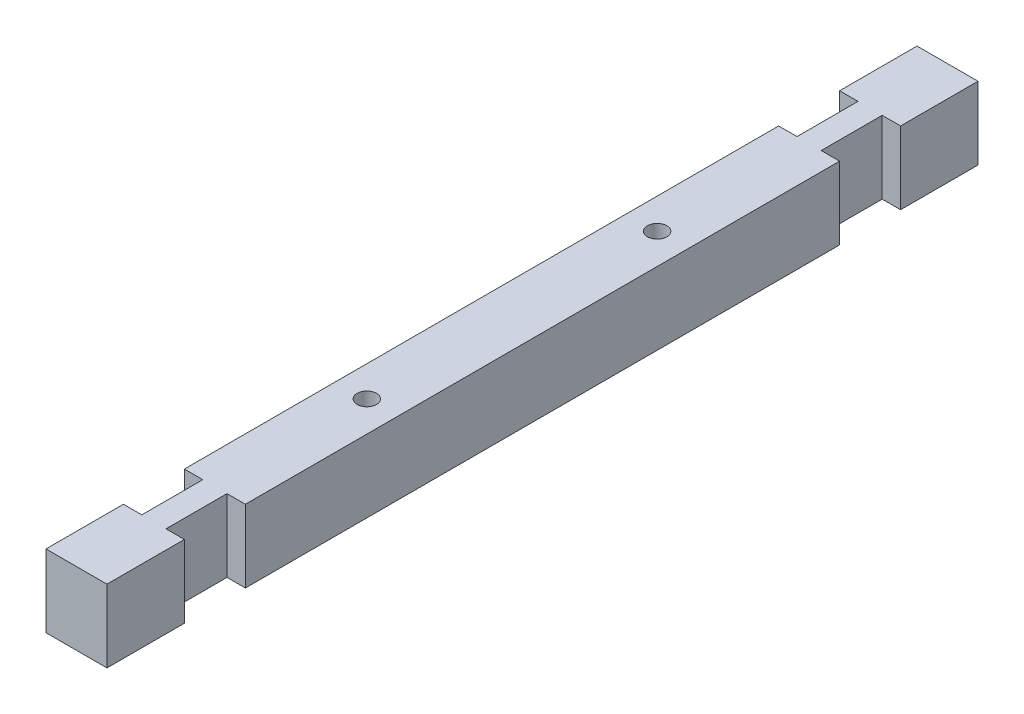
ISO-10303-21;
HEADER;
FILE_DESCRIPTION(('STEP AP214'),'2;1');
FILE_NAME('part.step','',(''),(''),'','','');
FILE_SCHEMA(('AUTOMOTIVE_DESIGN { 1 0 10303 214 1 1 1 1 }'));
ENDSEC;
DATA;
#1=APPLICATION_CONTEXT('core data for automotive mechanical design processes');
#2=APPLICATION_PROTOCOL_DEFINITION('international standard','automotive_design',2000,#1);
#3=PRODUCT_CONTEXT('',#1,'mechanical');
#4=PRODUCT('Part','Part','',(#3));
#5=PRODUCT_RELATED_PRODUCT_CATEGORY('part','',(#4));
#6=PRODUCT_DEFINITION_FORMATION('','',#4);
#7=PRODUCT_DEFINITION_CONTEXT('part definition',#1,'design');
#8=PRODUCT_DEFINITION('design','',#6,#7);
#9=PRODUCT_DEFINITION_SHAPE('','',#8);
#10=(LENGTH_UNIT() NAMED_UNIT(*) SI_UNIT(.MILLI.,.METRE.));
#11=(NAMED_UNIT(*) PLANE_ANGLE_UNIT() SI_UNIT($,.RADIAN.));
#12=(NAMED_UNIT(*) SI_UNIT($,.STERADIAN.) SOLID_ANGLE_UNIT());
#13=UNCERTAINTY_MEASURE_WITH_UNIT(LENGTH_MEASURE(1.E-05),#10,'distance_accuracy_value','');
#14=(GEOMETRIC_REPRESENTATION_CONTEXT(3) GLOBAL_UNCERTAINTY_ASSIGNED_CONTEXT((#13)) GLOBAL_UNIT_ASSIGNED_CONTEXT((#10,
#11,#12)) REPRESENTATION_CONTEXT('',''));
#15=CARTESIAN_POINT('',(0.,0.,0.));
#16=DIRECTION('',(0.,0.,1.));
#17=DIRECTION('',(1.,0.,0.));
#18=AXIS2_PLACEMENT_3D('',#15,#16,#17);
#19=CARTESIAN_POINT('',(0.,0.,900.));
#20=DIRECTION('',(1.,0.,0.));
#21=DIRECTION('',(0.,0.,-1.));
#22=AXIS2_PLACEMENT_3D('',#19,#20,#21);
#23=PLANE('',#22);
#24=DIRECTION('',(0.,-1.,0.));
#25=VECTOR('',#24,1.);
#26=CARTESIAN_POINT('',(0.,75.0000000000001,143.));
#27=LINE('',#26,#25);
#28=CARTESIAN_POINT('',(0.,75.0000000000001,143.));
#29=VERTEX_POINT('',#28);
#30=CARTESIAN_POINT('',(0.,0.,143.));
#31=VERTEX_POINT('',#30);
#32=EDGE_CURVE('E433',#29,#31,#27,.T.);
#33=ORIENTED_EDGE('',*,*,#32,.T.);
#34=DIRECTION('',(0.,0.,-1.));
#35=VECTOR('',#34,1.);
#36=CARTESIAN_POINT('',(0.,0.,900.));
#37=LINE('',#36,#35);
#38=CARTESIAN_POINT('',(0.,0.,757.));
#39=VERTEX_POINT('',#38);
#40=EDGE_CURVE('E41',#39,#31,#37,.T.);
#41=ORIENTED_EDGE('',*,*,#40,.F.);
#42=DIRECTION('',(0.,1.,0.));
#43=VECTOR('',#42,1.);
#44=CARTESIAN_POINT('',(0.,75.0000000000001,757.));
#45=LINE('',#44,#43);
#46=CARTESIAN_POINT('',(0.,75.0000000000001,757.));
#47=VERTEX_POINT('',#46);
#48=EDGE_CURVE('E202',#39,#47,#45,.T.);
#49=ORIENTED_EDGE('',*,*,#48,.T.);
#50=DIRECTION('',(0.,0.,-1.));
#51=VECTOR('',#50,1.);
#52=CARTESIAN_POINT('',(0.,75.,900.));
#53=LINE('',#52,#51);
#54=EDGE_CURVE('E298',#47,#29,#53,.T.);
#55=ORIENTED_EDGE('',*,*,#54,.T.);
#56=EDGE_LOOP('',(#33,#41,#49,#55));
#57=FACE_BOUND('',#56,.T.);
#58=ADVANCED_FACE('F33',(#57),#23,.F.);
#59=DIRECTION('',(0.,1.,0.));
#60=VECTOR('',#59,1.);
#61=CARTESIAN_POINT('',(0.,75.,80.));
#62=LINE('',#61,#60);
#63=CARTESIAN_POINT('',(0.,0.,80.));
#64=VERTEX_POINT('',#63);
#65=CARTESIAN_POINT('',(0.,75.,80.));
#66=VERTEX_POINT('',#65);
#67=EDGE_CURVE('E436',#64,#66,#62,.T.);
#68=ORIENTED_EDGE('',*,*,#67,.T.);
#69=CARTESIAN_POINT('',(0.,75.,0.));
#70=VERTEX_POINT('',#69);
#71=EDGE_CURVE('E283',#66,#70,#53,.T.);
#72=ORIENTED_EDGE('',*,*,#71,.T.);
#73=DIRECTION('',(0.,-1.,0.));
#74=VECTOR('',#73,1.);
#75=CARTESIAN_POINT('',(0.,0.,0.));
#76=LINE('',#75,#74);
#77=CARTESIAN_POINT('',(0.,0.,0.));
#78=VERTEX_POINT('',#77);
#79=EDGE_CURVE('E265',#70,#78,#76,.T.);
#80=ORIENTED_EDGE('',*,*,#79,.T.);
#81=EDGE_CURVE('E42',#64,#78,#37,.T.);
#82=ORIENTED_EDGE('',*,*,#81,.F.);
#83=EDGE_LOOP('',(#68,#72,#80,#82));
#84=FACE_BOUND('',#83,.T.);
#85=ADVANCED_FACE('F362',(#84),#23,.F.);
#86=CARTESIAN_POINT('',(0.,0.,900.));
#87=DIRECTION('',(0.,1.,0.));
#88=DIRECTION('',(0.,0.,1.));
#89=AXIS2_PLACEMENT_3D('',#86,#87,#88);
#90=PLANE('',#89);
#91=CARTESIAN_POINT('',(31.5,0.,600.));
#92=DIRECTION('',(0.,1.,0.));
#93=DIRECTION('',(0.,0.,-1.));
#94=AXIS2_PLACEMENT_3D('',#91,#92,#93);
#95=CIRCLE('',#94,10.);
#96=CARTESIAN_POINT('',(31.5,0.,590.));
#97=VERTEX_POINT('',#96);
#98=EDGE_CURVE('E422',#97,#97,#95,.T.);
#99=ORIENTED_EDGE('',*,*,#98,.T.);
#100=EDGE_LOOP('',(#99));
#101=FACE_BOUND('',#100,.T.);
#102=CARTESIAN_POINT('',(31.5,0.,300.));
#103=DIRECTION('',(0.,1.,0.));
#104=DIRECTION('',(0.,0.,1.));
#105=AXIS2_PLACEMENT_3D('',#102,#103,#104);
#106=CIRCLE('',#105,10.);
#107=CARTESIAN_POINT('',(31.5,0.,310.));
#108=VERTEX_POINT('',#107);
#109=EDGE_CURVE('E430',#108,#108,#106,.T.);
#110=ORIENTED_EDGE('',*,*,#109,.T.);
#111=EDGE_LOOP('',(#110));
#112=FACE_BOUND('',#111,.T.);
#113=DIRECTION('',(-1.,0.,0.));
#114=VECTOR('',#113,1.);
#115=CARTESIAN_POINT('',(19.,0.,143.));
#116=LINE('',#115,#114);
#117=CARTESIAN_POINT('',(19.,0.,143.));
#118=VERTEX_POINT('',#117);
#119=EDGE_CURVE('E173',#118,#31,#116,.T.);
#120=ORIENTED_EDGE('',*,*,#119,.F.);
#121=DIRECTION('',(0.,0.,-1.));
#122=VECTOR('',#121,1.);
#123=CARTESIAN_POINT('',(19.,0.,80.));
#124=LINE('',#123,#122);
#125=CARTESIAN_POINT('',(19.,0.,80.));
#126=VERTEX_POINT('',#125);
#127=EDGE_CURVE('E178',#118,#126,#124,.T.);
#128=ORIENTED_EDGE('',*,*,#127,.T.);
#129=DIRECTION('',(-1.,0.,0.));
#130=VECTOR('',#129,1.);
#131=CARTESIAN_POINT('',(19.,0.,80.));
#132=LINE('',#131,#130);
#133=EDGE_CURVE('E192',#126,#64,#132,.T.);
#134=ORIENTED_EDGE('',*,*,#133,.T.);
#135=ORIENTED_EDGE('',*,*,#81,.T.);
#136=DIRECTION('',(1.,0.,0.));
#137=VECTOR('',#136,1.);
#138=CARTESIAN_POINT('',(0.,0.,0.));
#139=LINE('',#138,#137);
#140=CARTESIAN_POINT('',(63.,0.,0.));
#141=VERTEX_POINT('',#140);
#142=EDGE_CURVE('E286',#78,#141,#139,.T.);
#143=ORIENTED_EDGE('',*,*,#142,.T.);
#144=DIRECTION('',(0.,0.,-1.));
#145=VECTOR('',#144,1.);
#146=CARTESIAN_POINT('',(63.,0.,900.));
#147=LINE('',#146,#145);
#148=CARTESIAN_POINT('',(63.,0.,80.));
#149=VERTEX_POINT('',#148);
#150=EDGE_CURVE('E301',#149,#141,#147,.T.);
#151=ORIENTED_EDGE('',*,*,#150,.F.);
#152=DIRECTION('',(1.,0.,0.));
#153=VECTOR('',#152,1.);
#154=CARTESIAN_POINT('',(44.,0.,80.));
#155=LINE('',#154,#153);
#156=CARTESIAN_POINT('',(44.,0.,80.));
#157=VERTEX_POINT('',#156);
#158=EDGE_CURVE('E242',#157,#149,#155,.T.);
#159=ORIENTED_EDGE('',*,*,#158,.F.);
#160=DIRECTION('',(0.,0.,-1.));
#161=VECTOR('',#160,1.);
#162=CARTESIAN_POINT('',(44.,0.,80.));
#163=LINE('',#162,#161);
#164=CARTESIAN_POINT('',(44.,0.,143.));
#165=VERTEX_POINT('',#164);
#166=EDGE_CURVE('E231',#165,#157,#163,.T.);
#167=ORIENTED_EDGE('',*,*,#166,.F.);
#168=DIRECTION('',(1.,0.,0.));
#169=VECTOR('',#168,1.);
#170=CARTESIAN_POINT('',(44.,0.,143.));
#171=LINE('',#170,#169);
#172=CARTESIAN_POINT('',(63.,0.,143.));
#173=VERTEX_POINT('',#172);
#174=EDGE_CURVE('E244',#165,#173,#171,.T.);
#175=ORIENTED_EDGE('',*,*,#174,.T.);
#176=CARTESIAN_POINT('',(63.,0.,757.));
#177=VERTEX_POINT('',#176);
#178=EDGE_CURVE('E305',#177,#173,#147,.T.);
#179=ORIENTED_EDGE('',*,*,#178,.F.);
#180=DIRECTION('',(1.,0.,0.));
#181=VECTOR('',#180,1.);
#182=CARTESIAN_POINT('',(44.,0.,757.));
#183=LINE('',#182,#181);
#184=CARTESIAN_POINT('',(44.,0.,757.));
#185=VERTEX_POINT('',#184);
#186=EDGE_CURVE('E269',#185,#177,#183,.T.);
#187=ORIENTED_EDGE('',*,*,#186,.F.);
#188=DIRECTION('',(0.,0.,-1.));
#189=VECTOR('',#188,1.);
#190=CARTESIAN_POINT('',(44.,0.,820.));
#191=LINE('',#190,#189);
#192=CARTESIAN_POINT('',(44.,0.,820.));
#193=VERTEX_POINT('',#192);
#194=EDGE_CURVE('E251',#193,#185,#191,.T.);
#195=ORIENTED_EDGE('',*,*,#194,.F.);
#196=DIRECTION('',(1.,0.,0.));
#197=VECTOR('',#196,1.);
#198=CARTESIAN_POINT('',(44.,0.,820.));
#199=LINE('',#198,#197);
#200=CARTESIAN_POINT('',(63.,0.,820.));
#201=VERTEX_POINT('',#200);
#202=EDGE_CURVE('E260',#193,#201,#199,.T.);
#203=ORIENTED_EDGE('',*,*,#202,.T.);
#204=CARTESIAN_POINT('',(63.,0.,900.));
#205=VERTEX_POINT('',#204);
#206=EDGE_CURVE('E303',#205,#201,#147,.T.);
#207=ORIENTED_EDGE('',*,*,#206,.F.);
#208=DIRECTION('',(1.,0.,0.));
#209=VECTOR('',#208,1.);
#210=CARTESIAN_POINT('',(0.,0.,900.));
#211=LINE('',#210,#209);
#212=CARTESIAN_POINT('',(0.,0.,900.));
#213=VERTEX_POINT('',#212);
#214=EDGE_CURVE('E276',#213,#205,#211,.T.);
#215=ORIENTED_EDGE('',*,*,#214,.F.);
#216=CARTESIAN_POINT('',(0.,0.,820.));
#217=VERTEX_POINT('',#216);
#218=EDGE_CURVE('E11',#213,#217,#37,.T.);
#219=ORIENTED_EDGE('',*,*,#218,.T.);
#220=DIRECTION('',(-1.,0.,0.));
#221=VECTOR('',#220,1.);
#222=CARTESIAN_POINT('',(19.,0.,820.));
#223=LINE('',#222,#221);
#224=CARTESIAN_POINT('',(19.,0.,820.));
#225=VERTEX_POINT('',#224);
#226=EDGE_CURVE('E221',#225,#217,#223,.T.);
#227=ORIENTED_EDGE('',*,*,#226,.F.);
#228=DIRECTION('',(0.,0.,-1.));
#229=VECTOR('',#228,1.);
#230=CARTESIAN_POINT('',(19.,0.,820.));
#231=LINE('',#230,#229);
#232=CARTESIAN_POINT('',(19.,0.,757.));
#233=VERTEX_POINT('',#232);
#234=EDGE_CURVE('E201',#225,#233,#231,.T.);
#235=ORIENTED_EDGE('',*,*,#234,.T.);
#236=DIRECTION('',(-1.,0.,0.));
#237=VECTOR('',#236,1.);
#238=CARTESIAN_POINT('',(19.,0.,757.));
#239=LINE('',#238,#237);
#240=EDGE_CURVE('E219',#233,#39,#239,.T.);
#241=ORIENTED_EDGE('',*,*,#240,.T.);
#242=ORIENTED_EDGE('',*,*,#40,.T.);
#243=EDGE_LOOP('',(#120,#128,#134,#135,#143,#151,#159,#167,#175,#179,#187,#195,#203,#207,#215,
#219,#227,#235,#241,#242));
#244=FACE_BOUND('',#243,.T.);
#245=ADVANCED_FACE('F189',(#101,#112,#244),#90,.F.);
#246=CARTESIAN_POINT('',(0.,75.,900.));
#247=DIRECTION('',(0.,-1.,0.));
#248=DIRECTION('',(0.,0.,-1.));
#249=AXIS2_PLACEMENT_3D('',#246,#247,#248);
#250=PLANE('',#249);
#251=CARTESIAN_POINT('',(31.5,75.,600.));
#252=DIRECTION('',(0.,1.,0.));
#253=DIRECTION('',(0.,0.,-1.));
#254=AXIS2_PLACEMENT_3D('',#251,#252,#253);
#255=CIRCLE('',#254,10.);
#256=CARTESIAN_POINT('',(31.5,75.,590.));
#257=VERTEX_POINT('',#256);
#258=EDGE_CURVE('E425',#257,#257,#255,.T.);
#259=ORIENTED_EDGE('',*,*,#258,.F.);
#260=EDGE_LOOP('',(#259));
#261=FACE_BOUND('',#260,.T.);
#262=CARTESIAN_POINT('',(31.5,75.,300.));
#263=DIRECTION('',(0.,1.,0.));
#264=DIRECTION('',(0.,0.,1.));
#265=AXIS2_PLACEMENT_3D('',#262,#263,#264);
#266=CIRCLE('',#265,10.);
#267=CARTESIAN_POINT('',(31.5,75.,310.));
#268=VERTEX_POINT('',#267);
#269=EDGE_CURVE('E427',#268,#268,#266,.T.);
#270=ORIENTED_EDGE('',*,*,#269,.F.);
#271=EDGE_LOOP('',(#270));
#272=FACE_BOUND('',#271,.T.);
#273=DIRECTION('',(-1.,0.,0.));
#274=VECTOR('',#273,1.);
#275=CARTESIAN_POINT('',(19.,75.0000000000001,143.));
#276=LINE('',#275,#274);
#277=CARTESIAN_POINT('',(19.,75.,143.));
#278=VERTEX_POINT('',#277);
#279=EDGE_CURVE('E49',#278,#29,#276,.T.);
#280=ORIENTED_EDGE('',*,*,#279,.T.);
#281=ORIENTED_EDGE('',*,*,#54,.F.);
#282=DIRECTION('',(-1.,0.,0.));
#283=VECTOR('',#282,1.);
#284=CARTESIAN_POINT('',(19.,75.0000000000001,757.));
#285=LINE('',#284,#283);
#286=CARTESIAN_POINT('',(19.,75.0000000000001,757.));
#287=VERTEX_POINT('',#286);
#288=EDGE_CURVE('E217',#287,#47,#285,.T.);
#289=ORIENTED_EDGE('',*,*,#288,.F.);
#290=DIRECTION('',(0.,0.,1.));
#291=VECTOR('',#290,1.);
#292=CARTESIAN_POINT('',(19.,75.,820.));
#293=LINE('',#292,#291);
#294=CARTESIAN_POINT('',(19.,75.,820.));
#295=VERTEX_POINT('',#294);
#296=EDGE_CURVE('E207',#287,#295,#293,.T.);
#297=ORIENTED_EDGE('',*,*,#296,.T.);
#298=DIRECTION('',(-1.,0.,0.));
#299=VECTOR('',#298,1.);
#300=CARTESIAN_POINT('',(19.,75.,820.));
#301=LINE('',#300,#299);
#302=CARTESIAN_POINT('',(0.,75.,820.));
#303=VERTEX_POINT('',#302);
#304=EDGE_CURVE('E210',#295,#303,#301,.T.);
#305=ORIENTED_EDGE('',*,*,#304,.T.);
#306=CARTESIAN_POINT('',(0.,75.,900.));
#307=VERTEX_POINT('',#306);
#308=EDGE_CURVE('E294',#307,#303,#53,.T.);
#309=ORIENTED_EDGE('',*,*,#308,.F.);
#310=DIRECTION('',(-1.,0.,0.));
#311=VECTOR('',#310,1.);
#312=CARTESIAN_POINT('',(0.,75.,900.));
#313=LINE('',#312,#311);
#314=CARTESIAN_POINT('',(63.,75.,900.));
#315=VERTEX_POINT('',#314);
#316=EDGE_CURVE('E281',#315,#307,#313,.T.);
#317=ORIENTED_EDGE('',*,*,#316,.F.);
#318=DIRECTION('',(0.,0.,-1.));
#319=VECTOR('',#318,1.);
#320=CARTESIAN_POINT('',(63.,75.,900.));
#321=LINE('',#320,#319);
#322=CARTESIAN_POINT('',(63.,75.,820.));
#323=VERTEX_POINT('',#322);
#324=EDGE_CURVE('E299',#315,#323,#321,.T.);
#325=ORIENTED_EDGE('',*,*,#324,.T.);
#326=DIRECTION('',(1.,0.,0.));
#327=VECTOR('',#326,1.);
#328=CARTESIAN_POINT('',(44.,75.,820.));
#329=LINE('',#328,#327);
#330=CARTESIAN_POINT('',(44.,75.,820.));
#331=VERTEX_POINT('',#330);
#332=EDGE_CURVE('E263',#331,#323,#329,.T.);
#333=ORIENTED_EDGE('',*,*,#332,.F.);
#334=DIRECTION('',(0.,0.,1.));
#335=VECTOR('',#334,1.);
#336=CARTESIAN_POINT('',(44.,75.,820.));
#337=LINE('',#336,#335);
#338=CARTESIAN_POINT('',(44.,75.,757.));
#339=VERTEX_POINT('',#338);
#340=EDGE_CURVE('E257',#339,#331,#337,.T.);
#341=ORIENTED_EDGE('',*,*,#340,.F.);
#342=DIRECTION('',(1.,0.,0.));
#343=VECTOR('',#342,1.);
#344=CARTESIAN_POINT('',(44.,75.0000000000001,757.));
#345=LINE('',#344,#343);
#346=CARTESIAN_POINT('',(63.,75.0000000000001,757.));
#347=VERTEX_POINT('',#346);
#348=EDGE_CURVE('E266',#339,#347,#345,.T.);
#349=ORIENTED_EDGE('',*,*,#348,.T.);
#350=CARTESIAN_POINT('',(63.,75.0000000000001,143.));
#351=VERTEX_POINT('',#350);
#352=EDGE_CURVE('E302',#347,#351,#321,.T.);
#353=ORIENTED_EDGE('',*,*,#352,.T.);
#354=DIRECTION('',(1.,0.,0.));
#355=VECTOR('',#354,1.);
#356=CARTESIAN_POINT('',(44.,75.0000000000001,143.));
#357=LINE('',#356,#355);
#358=CARTESIAN_POINT('',(44.,75.0000000000001,143.));
#359=VERTEX_POINT('',#358);
#360=EDGE_CURVE('E235',#359,#351,#357,.T.);
#361=ORIENTED_EDGE('',*,*,#360,.F.);
#362=DIRECTION('',(0.,0.,1.));
#363=VECTOR('',#362,1.);
#364=CARTESIAN_POINT('',(44.,75.,80.));
#365=LINE('',#364,#363);
#366=CARTESIAN_POINT('',(44.,75.,80.));
#367=VERTEX_POINT('',#366);
#368=EDGE_CURVE('E224',#367,#359,#365,.T.);
#369=ORIENTED_EDGE('',*,*,#368,.F.);
#370=DIRECTION('',(1.,0.,0.));
#371=VECTOR('',#370,1.);
#372=CARTESIAN_POINT('',(44.,75.,80.));
#373=LINE('',#372,#371);
#374=CARTESIAN_POINT('',(63.,75.,80.));
#375=VERTEX_POINT('',#374);
#376=EDGE_CURVE('E238',#367,#375,#373,.T.);
#377=ORIENTED_EDGE('',*,*,#376,.T.);
#378=CARTESIAN_POINT('',(63.,75.,0.));
#379=VERTEX_POINT('',#378);
#380=EDGE_CURVE('E297',#375,#379,#321,.T.);
#381=ORIENTED_EDGE('',*,*,#380,.T.);
#382=DIRECTION('',(-1.,0.,0.));
#383=VECTOR('',#382,1.);
#384=CARTESIAN_POINT('',(0.,75.,0.));
#385=LINE('',#384,#383);
#386=EDGE_CURVE('E277',#379,#70,#385,.T.);
#387=ORIENTED_EDGE('',*,*,#386,.T.);
#388=ORIENTED_EDGE('',*,*,#71,.F.);
#389=DIRECTION('',(-1.,0.,0.));
#390=VECTOR('',#389,1.);
#391=CARTESIAN_POINT('',(19.,75.,80.));
#392=LINE('',#391,#390);
#393=CARTESIAN_POINT('',(19.,75.,80.));
#394=VERTEX_POINT('',#393);
#395=EDGE_CURVE('E196',#394,#66,#392,.T.);
#396=ORIENTED_EDGE('',*,*,#395,.F.);
#397=DIRECTION('',(0.,0.,1.));
#398=VECTOR('',#397,1.);
#399=CARTESIAN_POINT('',(19.,75.,80.));
#400=LINE('',#399,#398);
#401=EDGE_CURVE('E179',#394,#278,#400,.T.);
#402=ORIENTED_EDGE('',*,*,#401,.T.);
#403=EDGE_LOOP('',(#280,#281,#289,#297,#305,#309,#317,#325,#333,#341,#349,#353,#361,#369,#377,
#381,#387,#388,#396,#402));
#404=FACE_BOUND('',#403,.T.);
#405=ADVANCED_FACE('F326',(#261,#272,#404),#250,.F.);
#406=DIRECTION('',(0.,-1.,0.));
#407=VECTOR('',#406,1.);
#408=CARTESIAN_POINT('',(0.,75.,820.));
#409=LINE('',#408,#407);
#410=EDGE_CURVE('E194',#303,#217,#409,.T.);
#411=ORIENTED_EDGE('',*,*,#410,.T.);
#412=ORIENTED_EDGE('',*,*,#218,.F.);
#413=DIRECTION('',(0.,-1.,0.));
#414=VECTOR('',#413,1.);
#415=CARTESIAN_POINT('',(0.,0.,900.));
#416=LINE('',#415,#414);
#417=EDGE_CURVE('E273',#307,#213,#416,.T.);
#418=ORIENTED_EDGE('',*,*,#417,.F.);
#419=ORIENTED_EDGE('',*,*,#308,.T.);
#420=EDGE_LOOP('',(#411,#412,#418,#419));
#421=FACE_BOUND('',#420,.T.);
#422=ADVANCED_FACE('F35',(#421),#23,.F.);
#423=CARTESIAN_POINT('',(63.,0.,900.));
#424=DIRECTION('',(-1.,0.,0.));
#425=DIRECTION('',(0.,0.,1.));
#426=AXIS2_PLACEMENT_3D('',#423,#424,#425);
#427=PLANE('',#426);
#428=ORIENTED_EDGE('',*,*,#380,.F.);
#429=DIRECTION('',(0.,1.,0.));
#430=VECTOR('',#429,1.);
#431=CARTESIAN_POINT('',(63.,75.,80.));
#432=LINE('',#431,#430);
#433=EDGE_CURVE('E228',#149,#375,#432,.T.);
#434=ORIENTED_EDGE('',*,*,#433,.F.);
#435=ORIENTED_EDGE('',*,*,#150,.T.);
#436=DIRECTION('',(0.,1.,0.));
#437=VECTOR('',#436,1.);
#438=CARTESIAN_POINT('',(63.,0.,0.));
#439=LINE('',#438,#437);
#440=EDGE_CURVE('E289',#141,#379,#439,.T.);
#441=ORIENTED_EDGE('',*,*,#440,.T.);
#442=EDGE_LOOP('',(#428,#434,#435,#441));
#443=FACE_BOUND('',#442,.T.);
#444=ADVANCED_FACE('F315',(#443),#427,.F.);
#445=ORIENTED_EDGE('',*,*,#206,.T.);
#446=DIRECTION('',(0.,-1.,0.));
#447=VECTOR('',#446,1.);
#448=CARTESIAN_POINT('',(63.,75.,820.));
#449=LINE('',#448,#447);
#450=EDGE_CURVE('E241',#323,#201,#449,.T.);
#451=ORIENTED_EDGE('',*,*,#450,.F.);
#452=ORIENTED_EDGE('',*,*,#324,.F.);
#453=DIRECTION('',(0.,1.,0.));
#454=VECTOR('',#453,1.);
#455=CARTESIAN_POINT('',(63.,0.,900.));
#456=LINE('',#455,#454);
#457=EDGE_CURVE('E279',#205,#315,#456,.T.);
#458=ORIENTED_EDGE('',*,*,#457,.F.);
#459=EDGE_LOOP('',(#445,#451,#452,#458));
#460=FACE_BOUND('',#459,.T.);
#461=ADVANCED_FACE('F374',(#460),#427,.F.);
#462=ORIENTED_EDGE('',*,*,#178,.T.);
#463=DIRECTION('',(0.,-1.,0.));
#464=VECTOR('',#463,1.);
#465=CARTESIAN_POINT('',(63.,75.0000000000001,143.));
#466=LINE('',#465,#464);
#467=EDGE_CURVE('E223',#351,#173,#466,.T.);
#468=ORIENTED_EDGE('',*,*,#467,.F.);
#469=ORIENTED_EDGE('',*,*,#352,.F.);
#470=DIRECTION('',(0.,1.,0.));
#471=VECTOR('',#470,1.);
#472=CARTESIAN_POINT('',(63.,75.0000000000001,757.));
#473=LINE('',#472,#471);
#474=EDGE_CURVE('E252',#177,#347,#473,.T.);
#475=ORIENTED_EDGE('',*,*,#474,.F.);
#476=EDGE_LOOP('',(#462,#468,#469,#475));
#477=FACE_BOUND('',#476,.T.);
#478=ADVANCED_FACE('F338',(#477),#427,.F.);
#479=CARTESIAN_POINT('',(0.,0.,900.));
#480=DIRECTION('',(0.,0.,-1.));
#481=DIRECTION('',(-1.,0.,0.));
#482=AXIS2_PLACEMENT_3D('',#479,#480,#481);
#483=PLANE('',#482);
#484=ORIENTED_EDGE('',*,*,#417,.T.);
#485=ORIENTED_EDGE('',*,*,#214,.T.);
#486=ORIENTED_EDGE('',*,*,#457,.T.);
#487=ORIENTED_EDGE('',*,*,#316,.T.);
#488=EDGE_LOOP('',(#484,#485,#486,#487));
#489=FACE_BOUND('',#488,.T.);
#490=ADVANCED_FACE('F384',(#489),#483,.F.);
#491=CARTESIAN_POINT('',(0.,0.,0.));
#492=DIRECTION('',(0.,0.,-1.));
#493=DIRECTION('',(-1.,0.,0.));
#494=AXIS2_PLACEMENT_3D('',#491,#492,#493);
#495=PLANE('',#494);
#496=ORIENTED_EDGE('',*,*,#79,.F.);
#497=ORIENTED_EDGE('',*,*,#386,.F.);
#498=ORIENTED_EDGE('',*,*,#440,.F.);
#499=ORIENTED_EDGE('',*,*,#142,.F.);
#500=EDGE_LOOP('',(#496,#497,#498,#499));
#501=FACE_BOUND('',#500,.T.);
#502=ADVANCED_FACE('F323',(#501),#495,.T.);
#503=CARTESIAN_POINT('',(44.,75.,820.));
#504=DIRECTION('',(0.,0.,1.));
#505=DIRECTION('',(1.,0.,0.));
#506=AXIS2_PLACEMENT_3D('',#503,#504,#505);
#507=PLANE('',#506);
#508=ORIENTED_EDGE('',*,*,#450,.T.);
#509=ORIENTED_EDGE('',*,*,#202,.F.);
#510=DIRECTION('',(0.,-1.,0.));
#511=VECTOR('',#510,1.);
#512=CARTESIAN_POINT('',(44.,75.,820.));
#513=LINE('',#512,#511);
#514=EDGE_CURVE('E248',#331,#193,#513,.T.);
#515=ORIENTED_EDGE('',*,*,#514,.F.);
#516=ORIENTED_EDGE('',*,*,#332,.T.);
#517=EDGE_LOOP('',(#508,#509,#515,#516));
#518=FACE_BOUND('',#517,.T.);
#519=ADVANCED_FACE('F457',(#518),#507,.F.);
#520=CARTESIAN_POINT('',(44.,75.0000000000001,757.));
#521=DIRECTION('',(0.,0.,-1.));
#522=DIRECTION('',(-1.,0.,0.));
#523=AXIS2_PLACEMENT_3D('',#520,#521,#522);
#524=PLANE('',#523);
#525=ORIENTED_EDGE('',*,*,#474,.T.);
#526=ORIENTED_EDGE('',*,*,#348,.F.);
#527=DIRECTION('',(0.,1.,0.));
#528=VECTOR('',#527,1.);
#529=CARTESIAN_POINT('',(44.,75.0000000000001,757.));
#530=LINE('',#529,#528);
#531=EDGE_CURVE('E255',#185,#339,#530,.T.);
#532=ORIENTED_EDGE('',*,*,#531,.F.);
#533=ORIENTED_EDGE('',*,*,#186,.T.);
#534=EDGE_LOOP('',(#525,#526,#532,#533));
#535=FACE_BOUND('',#534,.T.);
#536=ADVANCED_FACE('F357',(#535),#524,.F.);
#537=CARTESIAN_POINT('',(44.,0.,0.));
#538=DIRECTION('',(1.,0.,0.));
#539=DIRECTION('',(0.,0.,-1.));
#540=AXIS2_PLACEMENT_3D('',#537,#538,#539);
#541=PLANE('',#540);
#542=ORIENTED_EDGE('',*,*,#514,.T.);
#543=ORIENTED_EDGE('',*,*,#194,.T.);
#544=ORIENTED_EDGE('',*,*,#531,.T.);
#545=ORIENTED_EDGE('',*,*,#340,.T.);
#546=EDGE_LOOP('',(#542,#543,#544,#545));
#547=FACE_BOUND('',#546,.T.);
#548=ADVANCED_FACE('F350',(#547),#541,.T.);
#549=CARTESIAN_POINT('',(44.,75.,80.));
#550=DIRECTION('',(0.,0.,-1.));
#551=DIRECTION('',(-1.,0.,0.));
#552=AXIS2_PLACEMENT_3D('',#549,#550,#551);
#553=PLANE('',#552);
#554=ORIENTED_EDGE('',*,*,#433,.T.);
#555=ORIENTED_EDGE('',*,*,#376,.F.);
#556=DIRECTION('',(0.,1.,0.));
#557=VECTOR('',#556,1.);
#558=CARTESIAN_POINT('',(44.,75.,80.));
#559=LINE('',#558,#557);
#560=EDGE_CURVE('E233',#157,#367,#559,.T.);
#561=ORIENTED_EDGE('',*,*,#560,.F.);
#562=ORIENTED_EDGE('',*,*,#158,.T.);
#563=EDGE_LOOP('',(#554,#555,#561,#562));
#564=FACE_BOUND('',#563,.T.);
#565=ADVANCED_FACE('F348',(#564),#553,.F.);
#566=CARTESIAN_POINT('',(44.,75.0000000000001,143.));
#567=DIRECTION('',(0.,0.,1.));
#568=DIRECTION('',(1.,0.,0.));
#569=AXIS2_PLACEMENT_3D('',#566,#567,#568);
#570=PLANE('',#569);
#571=ORIENTED_EDGE('',*,*,#467,.T.);
#572=ORIENTED_EDGE('',*,*,#174,.F.);
#573=DIRECTION('',(0.,-1.,0.));
#574=VECTOR('',#573,1.);
#575=CARTESIAN_POINT('',(44.,75.0000000000001,143.));
#576=LINE('',#575,#574);
#577=EDGE_CURVE('E227',#359,#165,#576,.T.);
#578=ORIENTED_EDGE('',*,*,#577,.F.);
#579=ORIENTED_EDGE('',*,*,#360,.T.);
#580=EDGE_LOOP('',(#571,#572,#578,#579));
#581=FACE_BOUND('',#580,.T.);
#582=ADVANCED_FACE('F341',(#581),#570,.F.);
#583=CARTESIAN_POINT('',(44.,0.,0.));
#584=DIRECTION('',(1.,0.,0.));
#585=DIRECTION('',(0.,0.,-1.));
#586=AXIS2_PLACEMENT_3D('',#583,#584,#585);
#587=PLANE('',#586);
#588=ORIENTED_EDGE('',*,*,#368,.T.);
#589=ORIENTED_EDGE('',*,*,#577,.T.);
#590=ORIENTED_EDGE('',*,*,#166,.T.);
#591=ORIENTED_EDGE('',*,*,#560,.T.);
#592=EDGE_LOOP('',(#588,#589,#590,#591));
#593=FACE_BOUND('',#592,.T.);
#594=ADVANCED_FACE('F346',(#593),#587,.T.);
#595=CARTESIAN_POINT('',(19.,75.,820.));
#596=DIRECTION('',(0.,0.,-1.));
#597=DIRECTION('',(-1.,0.,0.));
#598=AXIS2_PLACEMENT_3D('',#595,#596,#597);
#599=PLANE('',#598);
#600=ORIENTED_EDGE('',*,*,#410,.F.);
#601=ORIENTED_EDGE('',*,*,#304,.F.);
#602=DIRECTION('',(0.,-1.,0.));
#603=VECTOR('',#602,1.);
#604=CARTESIAN_POINT('',(19.,75.,820.));
#605=LINE('',#604,#603);
#606=EDGE_CURVE('E57',#295,#225,#605,.T.);
#607=ORIENTED_EDGE('',*,*,#606,.T.);
#608=ORIENTED_EDGE('',*,*,#226,.T.);
#609=EDGE_LOOP('',(#600,#601,#607,#608));
#610=FACE_BOUND('',#609,.T.);
#611=ADVANCED_FACE('F388',(#610),#599,.T.);
#612=CARTESIAN_POINT('',(19.,75.0000000000001,757.));
#613=DIRECTION('',(0.,0.,1.));
#614=DIRECTION('',(1.,0.,0.));
#615=AXIS2_PLACEMENT_3D('',#612,#613,#614);
#616=PLANE('',#615);
#617=ORIENTED_EDGE('',*,*,#48,.F.);
#618=ORIENTED_EDGE('',*,*,#240,.F.);
#619=DIRECTION('',(0.,1.,0.));
#620=VECTOR('',#619,1.);
#621=CARTESIAN_POINT('',(19.,75.0000000000001,757.));
#622=LINE('',#621,#620);
#623=EDGE_CURVE('E205',#233,#287,#622,.T.);
#624=ORIENTED_EDGE('',*,*,#623,.T.);
#625=ORIENTED_EDGE('',*,*,#288,.T.);
#626=EDGE_LOOP('',(#617,#618,#624,#625));
#627=FACE_BOUND('',#626,.T.);
#628=ADVANCED_FACE('F390',(#627),#616,.T.);
#629=CARTESIAN_POINT('',(19.,0.,0.));
#630=DIRECTION('',(1.,0.,0.));
#631=DIRECTION('',(0.,0.,-1.));
#632=AXIS2_PLACEMENT_3D('',#629,#630,#631);
#633=PLANE('',#632);
#634=ORIENTED_EDGE('',*,*,#606,.F.);
#635=ORIENTED_EDGE('',*,*,#296,.F.);
#636=ORIENTED_EDGE('',*,*,#623,.F.);
#637=ORIENTED_EDGE('',*,*,#234,.F.);
#638=EDGE_LOOP('',(#634,#635,#636,#637));
#639=FACE_BOUND('',#638,.T.);
#640=ADVANCED_FACE('F396',(#639),#633,.F.);
#641=CARTESIAN_POINT('',(19.,75.0000000000001,143.));
#642=DIRECTION('',(0.,0.,-1.));
#643=DIRECTION('',(-1.,0.,0.));
#644=AXIS2_PLACEMENT_3D('',#641,#642,#643);
#645=PLANE('',#644);
#646=ORIENTED_EDGE('',*,*,#32,.F.);
#647=ORIENTED_EDGE('',*,*,#279,.F.);
#648=DIRECTION('',(0.,-1.,0.));
#649=VECTOR('',#648,1.);
#650=CARTESIAN_POINT('',(19.,75.0000000000001,143.));
#651=LINE('',#650,#649);
#652=EDGE_CURVE('E169',#278,#118,#651,.T.);
#653=ORIENTED_EDGE('',*,*,#652,.T.);
#654=ORIENTED_EDGE('',*,*,#119,.T.);
#655=EDGE_LOOP('',(#646,#647,#653,#654));
#656=FACE_BOUND('',#655,.T.);
#657=ADVANCED_FACE('F171',(#656),#645,.T.);
#658=CARTESIAN_POINT('',(19.,75.,80.));
#659=DIRECTION('',(0.,0.,1.));
#660=DIRECTION('',(1.,0.,0.));
#661=AXIS2_PLACEMENT_3D('',#658,#659,#660);
#662=PLANE('',#661);
#663=ORIENTED_EDGE('',*,*,#67,.F.);
#664=ORIENTED_EDGE('',*,*,#133,.F.);
#665=DIRECTION('',(0.,1.,0.));
#666=VECTOR('',#665,1.);
#667=CARTESIAN_POINT('',(19.,75.,80.));
#668=LINE('',#667,#666);
#669=EDGE_CURVE('E184',#126,#394,#668,.T.);
#670=ORIENTED_EDGE('',*,*,#669,.T.);
#671=ORIENTED_EDGE('',*,*,#395,.T.);
#672=EDGE_LOOP('',(#663,#664,#670,#671));
#673=FACE_BOUND('',#672,.T.);
#674=ADVANCED_FACE('F404',(#673),#662,.T.);
#675=CARTESIAN_POINT('',(19.,0.,0.));
#676=DIRECTION('',(1.,0.,0.));
#677=DIRECTION('',(0.,0.,-1.));
#678=AXIS2_PLACEMENT_3D('',#675,#676,#677);
#679=PLANE('',#678);
#680=ORIENTED_EDGE('',*,*,#401,.F.);
#681=ORIENTED_EDGE('',*,*,#669,.F.);
#682=ORIENTED_EDGE('',*,*,#127,.F.);
#683=ORIENTED_EDGE('',*,*,#652,.F.);
#684=EDGE_LOOP('',(#680,#681,#682,#683));
#685=FACE_BOUND('',#684,.T.);
#686=ADVANCED_FACE('F183',(#685),#679,.F.);
#687=CARTESIAN_POINT('',(31.5,0.,300.));
#688=DIRECTION('',(0.,1.,0.));
#689=DIRECTION('',(0.,0.,1.));
#690=AXIS2_PLACEMENT_3D('',#687,#688,#689);
#691=CYLINDRICAL_SURFACE('',#690,10.);
#692=ORIENTED_EDGE('',*,*,#109,.F.);
#693=EDGE_LOOP('',(#692));
#694=FACE_BOUND('',#693,.T.);
#695=ORIENTED_EDGE('',*,*,#269,.T.);
#696=EDGE_LOOP('',(#695));
#697=FACE_BOUND('',#696,.T.);
#698=ADVANCED_FACE('F410',(#694,#697),#691,.F.);
#699=CARTESIAN_POINT('',(31.5,0.,600.));
#700=DIRECTION('',(0.,1.,0.));
#701=DIRECTION('',(0.,0.,1.));
#702=AXIS2_PLACEMENT_3D('',#699,#700,#701);
#703=CYLINDRICAL_SURFACE('',#702,10.);
#704=ORIENTED_EDGE('',*,*,#98,.F.);
#705=EDGE_LOOP('',(#704));
#706=FACE_BOUND('',#705,.T.);
#707=ORIENTED_EDGE('',*,*,#258,.T.);
#708=EDGE_LOOP('',(#707));
#709=FACE_BOUND('',#708,.T.);
#710=ADVANCED_FACE('F413',(#706,#709),#703,.F.);
#711=CLOSED_SHELL('',(#58,#85,#245,#405,#422,#444,#461,#478,#490,#502,#519,#536,#548,#565,#582,
#594,#611,#628,#640,#657,#674,#686,#698,#710));
#712=MANIFOLD_SOLID_BREP('B2',#711);
#713=ADVANCED_BREP_SHAPE_REPRESENTATION('',(#18,#712),#14);
#714=SHAPE_DEFINITION_REPRESENTATION(#9,#713);
ENDSEC;
END-ISO-10303-21;
